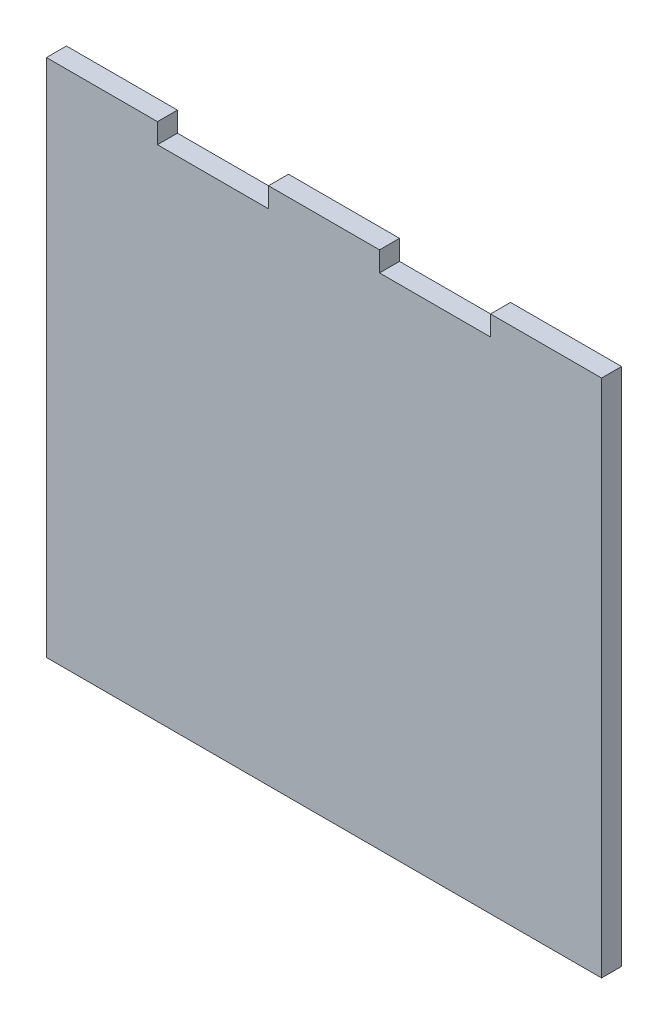
ISO-10303-21;
HEADER;
FILE_DESCRIPTION(('STEP AP214'),'2;1');
FILE_NAME('part.step','',(''),(''),'','','');
FILE_SCHEMA(('AUTOMOTIVE_DESIGN { 1 0 10303 214 1 1 1 1 }'));
ENDSEC;
DATA;
#1=APPLICATION_CONTEXT('core data for automotive mechanical design processes');
#2=APPLICATION_PROTOCOL_DEFINITION('international standard','automotive_design',2000,#1);
#3=PRODUCT_CONTEXT('',#1,'mechanical');
#4=PRODUCT('Part','Part','',(#3));
#5=PRODUCT_RELATED_PRODUCT_CATEGORY('part','',(#4));
#6=PRODUCT_DEFINITION_FORMATION('','',#4);
#7=PRODUCT_DEFINITION_CONTEXT('part definition',#1,'design');
#8=PRODUCT_DEFINITION('design','',#6,#7);
#9=PRODUCT_DEFINITION_SHAPE('','',#8);
#10=(LENGTH_UNIT() NAMED_UNIT(*) SI_UNIT(.MILLI.,.METRE.));
#11=(NAMED_UNIT(*) PLANE_ANGLE_UNIT() SI_UNIT($,.RADIAN.));
#12=(NAMED_UNIT(*) SI_UNIT($,.STERADIAN.) SOLID_ANGLE_UNIT());
#13=UNCERTAINTY_MEASURE_WITH_UNIT(LENGTH_MEASURE(1.E-05),#10,'distance_accuracy_value','');
#14=(GEOMETRIC_REPRESENTATION_CONTEXT(3) GLOBAL_UNCERTAINTY_ASSIGNED_CONTEXT((#13)) GLOBAL_UNIT_ASSIGNED_CONTEXT((#10,
#11,#12)) REPRESENTATION_CONTEXT('',''));
#15=CARTESIAN_POINT('',(0.,0.,0.));
#16=DIRECTION('',(0.,0.,1.));
#17=DIRECTION('',(1.,0.,0.));
#18=AXIS2_PLACEMENT_3D('',#15,#16,#17);
#19=CARTESIAN_POINT('',(0.,118.872,4.572));
#20=DIRECTION('',(0.,-1.,0.));
#21=DIRECTION('',(0.,0.,-1.));
#22=AXIS2_PLACEMENT_3D('',#19,#20,#21);
#23=PLANE('',#22);
#24=DIRECTION('',(-1.,0.,0.));
#25=VECTOR('',#24,1.);
#26=CARTESIAN_POINT('',(0.,118.872,4.572));
#27=LINE('',#26,#25);
#28=CARTESIAN_POINT('',(25.4,118.872,4.572));
#29=VERTEX_POINT('',#28);
#30=CARTESIAN_POINT('',(0.,118.872,4.572));
#31=VERTEX_POINT('',#30);
#32=EDGE_CURVE('E190',#29,#31,#27,.T.);
#33=ORIENTED_EDGE('',*,*,#32,.F.);
#34=DIRECTION('',(0.,0.,1.));
#35=VECTOR('',#34,1.);
#36=CARTESIAN_POINT('',(25.4,118.872,0.));
#37=LINE('',#36,#35);
#38=CARTESIAN_POINT('',(25.4,118.872,0.));
#39=VERTEX_POINT('',#38);
#40=EDGE_CURVE('E152',#39,#29,#37,.T.);
#41=ORIENTED_EDGE('',*,*,#40,.F.);
#42=DIRECTION('',(-1.,0.,0.));
#43=VECTOR('',#42,1.);
#44=CARTESIAN_POINT('',(0.,118.872,0.));
#45=LINE('',#44,#43);
#46=CARTESIAN_POINT('',(0.,118.872,0.));
#47=VERTEX_POINT('',#46);
#48=EDGE_CURVE('E142',#39,#47,#45,.T.);
#49=ORIENTED_EDGE('',*,*,#48,.T.);
#50=DIRECTION('',(0.,0.,-1.));
#51=VECTOR('',#50,1.);
#52=CARTESIAN_POINT('',(0.,118.872,4.572));
#53=LINE('',#52,#51);
#54=EDGE_CURVE('E194',#31,#47,#53,.T.);
#55=ORIENTED_EDGE('',*,*,#54,.F.);
#56=EDGE_LOOP('',(#33,#41,#49,#55));
#57=FACE_BOUND('',#56,.T.);
#58=ADVANCED_FACE('F33',(#57),#23,.F.);
#59=CARTESIAN_POINT('',(76.2,118.872,0.));
#60=VERTEX_POINT('',#59);
#61=CARTESIAN_POINT('',(50.8,118.872,0.));
#62=VERTEX_POINT('',#61);
#63=EDGE_CURVE('E204',#60,#62,#45,.T.);
#64=ORIENTED_EDGE('',*,*,#63,.T.);
#65=DIRECTION('',(0.,0.,1.));
#66=VECTOR('',#65,1.);
#67=CARTESIAN_POINT('',(50.8,118.872,0.));
#68=LINE('',#67,#66);
#69=CARTESIAN_POINT('',(50.8,118.872,4.572));
#70=VERTEX_POINT('',#69);
#71=EDGE_CURVE('E155',#62,#70,#68,.T.);
#72=ORIENTED_EDGE('',*,*,#71,.T.);
#73=CARTESIAN_POINT('',(76.2,118.872,4.572));
#74=VERTEX_POINT('',#73);
#75=EDGE_CURVE('E195',#74,#70,#27,.T.);
#76=ORIENTED_EDGE('',*,*,#75,.F.);
#77=DIRECTION('',(0.,0.,1.));
#78=VECTOR('',#77,1.);
#79=CARTESIAN_POINT('',(76.2,118.872,0.));
#80=LINE('',#79,#78);
#81=EDGE_CURVE('E150',#60,#74,#80,.T.);
#82=ORIENTED_EDGE('',*,*,#81,.F.);
#83=EDGE_LOOP('',(#64,#72,#76,#82));
#84=FACE_BOUND('',#83,.T.);
#85=ADVANCED_FACE('F236',(#84),#23,.F.);
#86=CARTESIAN_POINT('',(0.,0.,4.572));
#87=DIRECTION('',(1.,0.,0.));
#88=DIRECTION('',(0.,0.,-1.));
#89=AXIS2_PLACEMENT_3D('',#86,#87,#88);
#90=PLANE('',#89);
#91=DIRECTION('',(0.,-1.,0.));
#92=VECTOR('',#91,1.);
#93=CARTESIAN_POINT('',(0.,0.,0.));
#94=LINE('',#93,#92);
#95=CARTESIAN_POINT('',(0.,0.,0.));
#96=VERTEX_POINT('',#95);
#97=EDGE_CURVE('E154',#47,#96,#94,.T.);
#98=ORIENTED_EDGE('',*,*,#97,.T.);
#99=DIRECTION('',(0.,0.,-1.));
#100=VECTOR('',#99,1.);
#101=CARTESIAN_POINT('',(0.,0.,4.572));
#102=LINE('',#101,#100);
#103=CARTESIAN_POINT('',(0.,0.,4.572));
#104=VERTEX_POINT('',#103);
#105=EDGE_CURVE('E11',#104,#96,#102,.T.);
#106=ORIENTED_EDGE('',*,*,#105,.F.);
#107=DIRECTION('',(0.,-1.,0.));
#108=VECTOR('',#107,1.);
#109=CARTESIAN_POINT('',(0.,0.,4.572));
#110=LINE('',#109,#108);
#111=EDGE_CURVE('E182',#31,#104,#110,.T.);
#112=ORIENTED_EDGE('',*,*,#111,.F.);
#113=ORIENTED_EDGE('',*,*,#54,.T.);
#114=EDGE_LOOP('',(#98,#106,#112,#113));
#115=FACE_BOUND('',#114,.T.);
#116=ADVANCED_FACE('F35',(#115),#90,.F.);
#117=CARTESIAN_POINT('',(0.,0.,4.572));
#118=DIRECTION('',(0.,1.,0.));
#119=DIRECTION('',(0.,0.,1.));
#120=AXIS2_PLACEMENT_3D('',#117,#118,#119);
#121=PLANE('',#120);
#122=DIRECTION('',(1.,0.,0.));
#123=VECTOR('',#122,1.);
#124=CARTESIAN_POINT('',(0.,0.,0.));
#125=LINE('',#124,#123);
#126=CARTESIAN_POINT('',(127.,0.,0.));
#127=VERTEX_POINT('',#126);
#128=EDGE_CURVE('E198',#96,#127,#125,.T.);
#129=ORIENTED_EDGE('',*,*,#128,.T.);
#130=DIRECTION('',(0.,0.,-1.));
#131=VECTOR('',#130,1.);
#132=CARTESIAN_POINT('',(127.,0.,4.572));
#133=LINE('',#132,#131);
#134=CARTESIAN_POINT('',(127.,0.,4.572));
#135=VERTEX_POINT('',#134);
#136=EDGE_CURVE('E41',#135,#127,#133,.T.);
#137=ORIENTED_EDGE('',*,*,#136,.F.);
#138=DIRECTION('',(1.,0.,0.));
#139=VECTOR('',#138,1.);
#140=CARTESIAN_POINT('',(0.,0.,4.572));
#141=LINE('',#140,#139);
#142=EDGE_CURVE('E185',#104,#135,#141,.T.);
#143=ORIENTED_EDGE('',*,*,#142,.F.);
#144=ORIENTED_EDGE('',*,*,#105,.T.);
#145=EDGE_LOOP('',(#129,#137,#143,#144));
#146=FACE_BOUND('',#145,.T.);
#147=ADVANCED_FACE('F227',(#146),#121,.F.);
#148=CARTESIAN_POINT('',(127.,0.,4.572));
#149=DIRECTION('',(-1.,0.,0.));
#150=DIRECTION('',(0.,0.,1.));
#151=AXIS2_PLACEMENT_3D('',#148,#149,#150);
#152=PLANE('',#151);
#153=DIRECTION('',(0.,1.,0.));
#154=VECTOR('',#153,1.);
#155=CARTESIAN_POINT('',(127.,0.,0.));
#156=LINE('',#155,#154);
#157=CARTESIAN_POINT('',(127.,118.872,0.));
#158=VERTEX_POINT('',#157);
#159=EDGE_CURVE('E200',#127,#158,#156,.T.);
#160=ORIENTED_EDGE('',*,*,#159,.T.);
#161=DIRECTION('',(0.,0.,-1.));
#162=VECTOR('',#161,1.);
#163=CARTESIAN_POINT('',(127.,118.872,4.572));
#164=LINE('',#163,#162);
#165=CARTESIAN_POINT('',(127.,118.872,4.572));
#166=VERTEX_POINT('',#165);
#167=EDGE_CURVE('E207',#166,#158,#164,.T.);
#168=ORIENTED_EDGE('',*,*,#167,.F.);
#169=DIRECTION('',(0.,1.,0.));
#170=VECTOR('',#169,1.);
#171=CARTESIAN_POINT('',(127.,0.,4.572));
#172=LINE('',#171,#170);
#173=EDGE_CURVE('E188',#135,#166,#172,.T.);
#174=ORIENTED_EDGE('',*,*,#173,.F.);
#175=ORIENTED_EDGE('',*,*,#136,.T.);
#176=EDGE_LOOP('',(#160,#168,#174,#175));
#177=FACE_BOUND('',#176,.T.);
#178=ADVANCED_FACE('F214',(#177),#152,.F.);
#179=CARTESIAN_POINT('',(101.6,118.872,0.));
#180=VERTEX_POINT('',#179);
#181=EDGE_CURVE('E186',#158,#180,#45,.T.);
#182=ORIENTED_EDGE('',*,*,#181,.T.);
#183=DIRECTION('',(0.,0.,1.));
#184=VECTOR('',#183,1.);
#185=CARTESIAN_POINT('',(101.6,118.872,0.));
#186=LINE('',#185,#184);
#187=CARTESIAN_POINT('',(101.6,118.872,4.572));
#188=VERTEX_POINT('',#187);
#189=EDGE_CURVE('E176',#180,#188,#186,.T.);
#190=ORIENTED_EDGE('',*,*,#189,.T.);
#191=EDGE_CURVE('E191',#166,#188,#27,.T.);
#192=ORIENTED_EDGE('',*,*,#191,.F.);
#193=ORIENTED_EDGE('',*,*,#167,.T.);
#194=EDGE_LOOP('',(#182,#190,#192,#193));
#195=FACE_BOUND('',#194,.T.);
#196=ADVANCED_FACE('F219',(#195),#23,.F.);
#197=CARTESIAN_POINT('',(0.,0.,4.572));
#198=DIRECTION('',(0.,0.,-1.));
#199=DIRECTION('',(-1.,0.,0.));
#200=AXIS2_PLACEMENT_3D('',#197,#198,#199);
#201=PLANE('',#200);
#202=DIRECTION('',(1.,0.,0.));
#203=VECTOR('',#202,1.);
#204=CARTESIAN_POINT('',(25.4,114.3,4.572));
#205=LINE('',#204,#203);
#206=CARTESIAN_POINT('',(25.4,114.3,4.572));
#207=VERTEX_POINT('',#206);
#208=CARTESIAN_POINT('',(50.8,114.3,4.572));
#209=VERTEX_POINT('',#208);
#210=EDGE_CURVE('E145',#207,#209,#205,.T.);
#211=ORIENTED_EDGE('',*,*,#210,.F.);
#212=DIRECTION('',(0.,-1.,0.));
#213=VECTOR('',#212,1.);
#214=CARTESIAN_POINT('',(25.4,118.872,4.572));
#215=LINE('',#214,#213);
#216=EDGE_CURVE('E128',#29,#207,#215,.T.);
#217=ORIENTED_EDGE('',*,*,#216,.F.);
#218=ORIENTED_EDGE('',*,*,#32,.T.);
#219=ORIENTED_EDGE('',*,*,#111,.T.);
#220=ORIENTED_EDGE('',*,*,#142,.T.);
#221=ORIENTED_EDGE('',*,*,#173,.T.);
#222=ORIENTED_EDGE('',*,*,#191,.T.);
#223=DIRECTION('',(0.,1.,0.));
#224=VECTOR('',#223,1.);
#225=CARTESIAN_POINT('',(101.6,118.872,4.572));
#226=LINE('',#225,#224);
#227=CARTESIAN_POINT('',(101.6,114.3,4.572));
#228=VERTEX_POINT('',#227);
#229=EDGE_CURVE('E163',#228,#188,#226,.T.);
#230=ORIENTED_EDGE('',*,*,#229,.F.);
#231=DIRECTION('',(1.,0.,0.));
#232=VECTOR('',#231,1.);
#233=CARTESIAN_POINT('',(76.2,114.3,4.572));
#234=LINE('',#233,#232);
#235=CARTESIAN_POINT('',(76.2,114.3,4.572));
#236=VERTEX_POINT('',#235);
#237=EDGE_CURVE('E171',#236,#228,#234,.T.);
#238=ORIENTED_EDGE('',*,*,#237,.F.);
#239=DIRECTION('',(0.,-1.,0.));
#240=VECTOR('',#239,1.);
#241=CARTESIAN_POINT('',(76.2,118.872,4.572));
#242=LINE('',#241,#240);
#243=EDGE_CURVE('E168',#74,#236,#242,.T.);
#244=ORIENTED_EDGE('',*,*,#243,.F.);
#245=ORIENTED_EDGE('',*,*,#75,.T.);
#246=DIRECTION('',(0.,1.,0.));
#247=VECTOR('',#246,1.);
#248=CARTESIAN_POINT('',(50.8,118.872,4.572));
#249=LINE('',#248,#247);
#250=EDGE_CURVE('E143',#209,#70,#249,.T.);
#251=ORIENTED_EDGE('',*,*,#250,.F.);
#252=EDGE_LOOP('',(#211,#217,#218,#219,#220,#221,#222,#230,#238,#244,#245,#251));
#253=FACE_BOUND('',#252,.T.);
#254=ADVANCED_FACE('F223',(#253),#201,.F.);
#255=CARTESIAN_POINT('',(0.,0.,0.));
#256=DIRECTION('',(0.,0.,-1.));
#257=DIRECTION('',(-1.,0.,0.));
#258=AXIS2_PLACEMENT_3D('',#255,#256,#257);
#259=PLANE('',#258);
#260=DIRECTION('',(0.,-1.,0.));
#261=VECTOR('',#260,1.);
#262=CARTESIAN_POINT('',(25.4,118.872,0.));
#263=LINE('',#262,#261);
#264=CARTESIAN_POINT('',(25.4,114.3,0.));
#265=VERTEX_POINT('',#264);
#266=EDGE_CURVE('E125',#39,#265,#263,.T.);
#267=ORIENTED_EDGE('',*,*,#266,.T.);
#268=DIRECTION('',(1.,0.,0.));
#269=VECTOR('',#268,1.);
#270=CARTESIAN_POINT('',(25.4,114.3,0.));
#271=LINE('',#270,#269);
#272=CARTESIAN_POINT('',(50.8,114.3,0.));
#273=VERTEX_POINT('',#272);
#274=EDGE_CURVE('E135',#265,#273,#271,.T.);
#275=ORIENTED_EDGE('',*,*,#274,.T.);
#276=DIRECTION('',(0.,1.,0.));
#277=VECTOR('',#276,1.);
#278=CARTESIAN_POINT('',(50.8,118.872,0.));
#279=LINE('',#278,#277);
#280=EDGE_CURVE('E48',#273,#62,#279,.T.);
#281=ORIENTED_EDGE('',*,*,#280,.T.);
#282=ORIENTED_EDGE('',*,*,#63,.F.);
#283=DIRECTION('',(0.,-1.,0.));
#284=VECTOR('',#283,1.);
#285=CARTESIAN_POINT('',(76.2,118.872,0.));
#286=LINE('',#285,#284);
#287=CARTESIAN_POINT('',(76.2,114.3,0.));
#288=VERTEX_POINT('',#287);
#289=EDGE_CURVE('E159',#60,#288,#286,.T.);
#290=ORIENTED_EDGE('',*,*,#289,.T.);
#291=DIRECTION('',(1.,0.,0.));
#292=VECTOR('',#291,1.);
#293=CARTESIAN_POINT('',(76.2,114.3,0.));
#294=LINE('',#293,#292);
#295=CARTESIAN_POINT('',(101.6,114.3,0.));
#296=VERTEX_POINT('',#295);
#297=EDGE_CURVE('E162',#288,#296,#294,.T.);
#298=ORIENTED_EDGE('',*,*,#297,.T.);
#299=DIRECTION('',(0.,1.,0.));
#300=VECTOR('',#299,1.);
#301=CARTESIAN_POINT('',(101.6,118.872,0.));
#302=LINE('',#301,#300);
#303=EDGE_CURVE('E56',#296,#180,#302,.T.);
#304=ORIENTED_EDGE('',*,*,#303,.T.);
#305=ORIENTED_EDGE('',*,*,#181,.F.);
#306=ORIENTED_EDGE('',*,*,#159,.F.);
#307=ORIENTED_EDGE('',*,*,#128,.F.);
#308=ORIENTED_EDGE('',*,*,#97,.F.);
#309=ORIENTED_EDGE('',*,*,#48,.F.);
#310=EDGE_LOOP('',(#267,#275,#281,#282,#290,#298,#304,#305,#306,#307,#308,#309));
#311=FACE_BOUND('',#310,.T.);
#312=ADVANCED_FACE('F140',(#311),#259,.T.);
#313=CARTESIAN_POINT('',(76.2,118.872,0.));
#314=DIRECTION('',(-1.,0.,0.));
#315=DIRECTION('',(0.,-1.,0.));
#316=AXIS2_PLACEMENT_3D('',#313,#314,#315);
#317=PLANE('',#316);
#318=ORIENTED_EDGE('',*,*,#243,.T.);
#319=DIRECTION('',(0.,0.,1.));
#320=VECTOR('',#319,1.);
#321=CARTESIAN_POINT('',(76.2,114.3,0.));
#322=LINE('',#321,#320);
#323=EDGE_CURVE('E167',#288,#236,#322,.T.);
#324=ORIENTED_EDGE('',*,*,#323,.F.);
#325=ORIENTED_EDGE('',*,*,#289,.F.);
#326=ORIENTED_EDGE('',*,*,#81,.T.);
#327=EDGE_LOOP('',(#318,#324,#325,#326));
#328=FACE_BOUND('',#327,.T.);
#329=ADVANCED_FACE('F241',(#328),#317,.F.);
#330=CARTESIAN_POINT('',(101.6,118.872,0.));
#331=DIRECTION('',(1.,0.,0.));
#332=DIRECTION('',(0.,0.,-1.));
#333=AXIS2_PLACEMENT_3D('',#330,#331,#332);
#334=PLANE('',#333);
#335=ORIENTED_EDGE('',*,*,#229,.T.);
#336=ORIENTED_EDGE('',*,*,#189,.F.);
#337=ORIENTED_EDGE('',*,*,#303,.F.);
#338=DIRECTION('',(0.,0.,1.));
#339=VECTOR('',#338,1.);
#340=CARTESIAN_POINT('',(101.6,114.3,0.));
#341=LINE('',#340,#339);
#342=EDGE_CURVE('E179',#296,#228,#341,.T.);
#343=ORIENTED_EDGE('',*,*,#342,.T.);
#344=EDGE_LOOP('',(#335,#336,#337,#343));
#345=FACE_BOUND('',#344,.T.);
#346=ADVANCED_FACE('F245',(#345),#334,.F.);
#347=CARTESIAN_POINT('',(76.2,114.3,0.));
#348=DIRECTION('',(0.,-1.,0.));
#349=DIRECTION('',(0.,0.,-1.));
#350=AXIS2_PLACEMENT_3D('',#347,#348,#349);
#351=PLANE('',#350);
#352=ORIENTED_EDGE('',*,*,#237,.T.);
#353=ORIENTED_EDGE('',*,*,#342,.F.);
#354=ORIENTED_EDGE('',*,*,#297,.F.);
#355=ORIENTED_EDGE('',*,*,#323,.T.);
#356=EDGE_LOOP('',(#352,#353,#354,#355));
#357=FACE_BOUND('',#356,.T.);
#358=ADVANCED_FACE('F244',(#357),#351,.F.);
#359=CARTESIAN_POINT('',(25.4,118.872,0.));
#360=DIRECTION('',(-1.,0.,0.));
#361=DIRECTION('',(0.,-1.,0.));
#362=AXIS2_PLACEMENT_3D('',#359,#360,#361);
#363=PLANE('',#362);
#364=ORIENTED_EDGE('',*,*,#216,.T.);
#365=DIRECTION('',(0.,0.,1.));
#366=VECTOR('',#365,1.);
#367=CARTESIAN_POINT('',(25.4,114.3,0.));
#368=LINE('',#367,#366);
#369=EDGE_CURVE('E121',#265,#207,#368,.T.);
#370=ORIENTED_EDGE('',*,*,#369,.F.);
#371=ORIENTED_EDGE('',*,*,#266,.F.);
#372=ORIENTED_EDGE('',*,*,#40,.T.);
#373=EDGE_LOOP('',(#364,#370,#371,#372));
#374=FACE_BOUND('',#373,.T.);
#375=ADVANCED_FACE('F123',(#374),#363,.F.);
#376=CARTESIAN_POINT('',(50.8,118.872,0.));
#377=DIRECTION('',(1.,0.,0.));
#378=DIRECTION('',(0.,1.,0.));
#379=AXIS2_PLACEMENT_3D('',#376,#377,#378);
#380=PLANE('',#379);
#381=ORIENTED_EDGE('',*,*,#250,.T.);
#382=ORIENTED_EDGE('',*,*,#71,.F.);
#383=ORIENTED_EDGE('',*,*,#280,.F.);
#384=DIRECTION('',(0.,0.,1.));
#385=VECTOR('',#384,1.);
#386=CARTESIAN_POINT('',(50.8,114.3,0.));
#387=LINE('',#386,#385);
#388=EDGE_CURVE('E132',#273,#209,#387,.T.);
#389=ORIENTED_EDGE('',*,*,#388,.T.);
#390=EDGE_LOOP('',(#381,#382,#383,#389));
#391=FACE_BOUND('',#390,.T.);
#392=ADVANCED_FACE('F325',(#391),#380,.F.);
#393=CARTESIAN_POINT('',(25.4,114.3,0.));
#394=DIRECTION('',(0.,-1.,0.));
#395=DIRECTION('',(0.,0.,-1.));
#396=AXIS2_PLACEMENT_3D('',#393,#394,#395);
#397=PLANE('',#396);
#398=ORIENTED_EDGE('',*,*,#210,.T.);
#399=ORIENTED_EDGE('',*,*,#388,.F.);
#400=ORIENTED_EDGE('',*,*,#274,.F.);
#401=ORIENTED_EDGE('',*,*,#369,.T.);
#402=EDGE_LOOP('',(#398,#399,#400,#401));
#403=FACE_BOUND('',#402,.T.);
#404=ADVANCED_FACE('F136',(#403),#397,.F.);
#405=CLOSED_SHELL('',(#58,#85,#116,#147,#178,#196,#254,#312,#329,#346,#358,#375,#392,#404));
#406=MANIFOLD_SOLID_BREP('B2',#405);
#407=ADVANCED_BREP_SHAPE_REPRESENTATION('',(#18,#406),#14);
#408=SHAPE_DEFINITION_REPRESENTATION(#9,#407);
ENDSEC;
END-ISO-10303-21;
